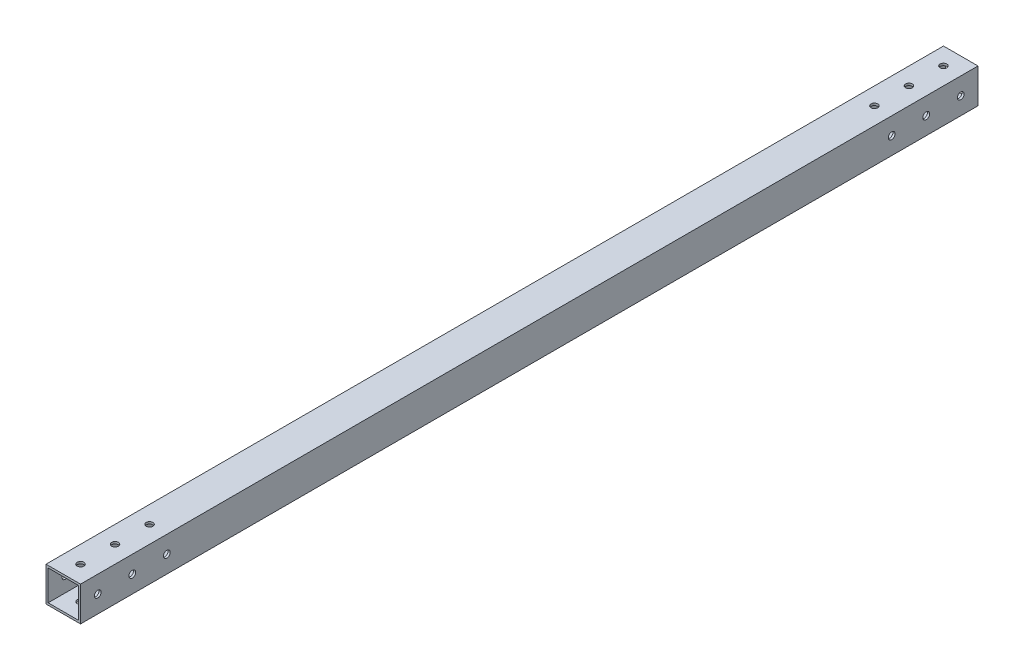
ISO-10303-21;
HEADER;
FILE_DESCRIPTION(('STEP AP214'),'2;1');
FILE_NAME('part.step','',(''),(''),'','','');
FILE_SCHEMA(('AUTOMOTIVE_DESIGN { 1 0 10303 214 1 1 1 1 }'));
ENDSEC;
DATA;
#1=APPLICATION_CONTEXT('core data for automotive mechanical design processes');
#2=APPLICATION_PROTOCOL_DEFINITION('international standard','automotive_design',2000,#1);
#3=PRODUCT_CONTEXT('',#1,'mechanical');
#4=PRODUCT('Part','Part','',(#3));
#5=PRODUCT_RELATED_PRODUCT_CATEGORY('part','',(#4));
#6=PRODUCT_DEFINITION_FORMATION('','',#4);
#7=PRODUCT_DEFINITION_CONTEXT('part definition',#1,'design');
#8=PRODUCT_DEFINITION('design','',#6,#7);
#9=PRODUCT_DEFINITION_SHAPE('','',#8);
#10=(LENGTH_UNIT() NAMED_UNIT(*) SI_UNIT(.MILLI.,.METRE.));
#11=(NAMED_UNIT(*) PLANE_ANGLE_UNIT() SI_UNIT($,.RADIAN.));
#12=(NAMED_UNIT(*) SI_UNIT($,.STERADIAN.) SOLID_ANGLE_UNIT());
#13=UNCERTAINTY_MEASURE_WITH_UNIT(LENGTH_MEASURE(1.E-05),#10,'distance_accuracy_value','');
#14=(GEOMETRIC_REPRESENTATION_CONTEXT(3) GLOBAL_UNCERTAINTY_ASSIGNED_CONTEXT((#13)) GLOBAL_UNIT_ASSIGNED_CONTEXT((#10,
#11,#12)) REPRESENTATION_CONTEXT('',''));
#15=CARTESIAN_POINT('',(0.,0.,0.));
#16=DIRECTION('',(0.,0.,1.));
#17=DIRECTION('',(1.,0.,0.));
#18=AXIS2_PLACEMENT_3D('',#15,#16,#17);
#19=CARTESIAN_POINT('',(0.,0.,330.2));
#20=DIRECTION('',(0.,0.,-1.));
#21=DIRECTION('',(-1.,0.,0.));
#22=AXIS2_PLACEMENT_3D('',#19,#20,#21);
#23=PLANE('',#22);
#24=DIRECTION('',(0.,-1.,0.));
#25=VECTOR('',#24,1.);
#26=CARTESIAN_POINT('',(0.,0.,330.2));
#27=LINE('',#26,#25);
#28=CARTESIAN_POINT('',(0.,25.4,330.2));
#29=VERTEX_POINT('',#28);
#30=CARTESIAN_POINT('',(0.,0.,330.2));
#31=VERTEX_POINT('',#30);
#32=EDGE_CURVE('E135',#29,#31,#27,.T.);
#33=ORIENTED_EDGE('',*,*,#32,.T.);
#34=DIRECTION('',(1.,0.,0.));
#35=VECTOR('',#34,1.);
#36=CARTESIAN_POINT('',(0.,0.,330.2));
#37=LINE('',#36,#35);
#38=CARTESIAN_POINT('',(25.4,0.,330.2));
#39=VERTEX_POINT('',#38);
#40=EDGE_CURVE('E138',#31,#39,#37,.T.);
#41=ORIENTED_EDGE('',*,*,#40,.T.);
#42=DIRECTION('',(0.,1.,0.));
#43=VECTOR('',#42,1.);
#44=CARTESIAN_POINT('',(25.4,0.,330.2));
#45=LINE('',#44,#43);
#46=CARTESIAN_POINT('',(25.4,25.4,330.2));
#47=VERTEX_POINT('',#46);
#48=EDGE_CURVE('E141',#39,#47,#45,.T.);
#49=ORIENTED_EDGE('',*,*,#48,.T.);
#50=DIRECTION('',(-1.,0.,0.));
#51=VECTOR('',#50,1.);
#52=CARTESIAN_POINT('',(0.,25.4,330.2));
#53=LINE('',#52,#51);
#54=EDGE_CURVE('E143',#47,#29,#53,.T.);
#55=ORIENTED_EDGE('',*,*,#54,.T.);
#56=EDGE_LOOP('',(#33,#41,#49,#55));
#57=FACE_BOUND('',#56,.T.);
#58=DIRECTION('',(0.,-1.,0.));
#59=VECTOR('',#58,1.);
#60=CARTESIAN_POINT('',(1.5875,0.,330.2));
#61=LINE('',#60,#59);
#62=CARTESIAN_POINT('',(1.5875,23.8125,330.2));
#63=VERTEX_POINT('',#62);
#64=CARTESIAN_POINT('',(1.5875,1.5875,330.2));
#65=VERTEX_POINT('',#64);
#66=EDGE_CURVE('E123',#63,#65,#61,.T.);
#67=ORIENTED_EDGE('',*,*,#66,.F.);
#68=DIRECTION('',(-1.,0.,0.));
#69=VECTOR('',#68,1.);
#70=CARTESIAN_POINT('',(0.,23.8125,330.2));
#71=LINE('',#70,#69);
#72=CARTESIAN_POINT('',(23.8125,23.8125,330.2));
#73=VERTEX_POINT('',#72);
#74=EDGE_CURVE('E107',#73,#63,#71,.T.);
#75=ORIENTED_EDGE('',*,*,#74,.F.);
#76=DIRECTION('',(0.,1.,0.));
#77=VECTOR('',#76,1.);
#78=CARTESIAN_POINT('',(23.8125,0.,330.2));
#79=LINE('',#78,#77);
#80=CARTESIAN_POINT('',(23.8125,1.5875,330.2));
#81=VERTEX_POINT('',#80);
#82=EDGE_CURVE('E132',#81,#73,#79,.T.);
#83=ORIENTED_EDGE('',*,*,#82,.F.);
#84=DIRECTION('',(1.,0.,0.));
#85=VECTOR('',#84,1.);
#86=CARTESIAN_POINT('',(0.,1.5875,330.2));
#87=LINE('',#86,#85);
#88=EDGE_CURVE('E125',#65,#81,#87,.T.);
#89=ORIENTED_EDGE('',*,*,#88,.F.);
#90=EDGE_LOOP('',(#67,#75,#83,#89));
#91=FACE_BOUND('',#90,.T.);
#92=ADVANCED_FACE('F35',(#57,#91),#23,.F.);
#93=CARTESIAN_POINT('',(0.,0.,-330.2));
#94=DIRECTION('',(0.,0.,-1.));
#95=DIRECTION('',(-1.,0.,0.));
#96=AXIS2_PLACEMENT_3D('',#93,#94,#95);
#97=PLANE('',#96);
#98=DIRECTION('',(0.,-1.,0.));
#99=VECTOR('',#98,1.);
#100=CARTESIAN_POINT('',(0.,0.,-330.2));
#101=LINE('',#100,#99);
#102=CARTESIAN_POINT('',(0.,25.4,-330.2));
#103=VERTEX_POINT('',#102);
#104=CARTESIAN_POINT('',(0.,0.,-330.2));
#105=VERTEX_POINT('',#104);
#106=EDGE_CURVE('E146',#103,#105,#101,.T.);
#107=ORIENTED_EDGE('',*,*,#106,.F.);
#108=DIRECTION('',(-1.,0.,0.));
#109=VECTOR('',#108,1.);
#110=CARTESIAN_POINT('',(0.,25.4,-330.2));
#111=LINE('',#110,#109);
#112=CARTESIAN_POINT('',(25.4,25.4,-330.2));
#113=VERTEX_POINT('',#112);
#114=EDGE_CURVE('E139',#113,#103,#111,.T.);
#115=ORIENTED_EDGE('',*,*,#114,.F.);
#116=DIRECTION('',(0.,1.,0.));
#117=VECTOR('',#116,1.);
#118=CARTESIAN_POINT('',(25.4,0.,-330.2));
#119=LINE('',#118,#117);
#120=CARTESIAN_POINT('',(25.4,0.,-330.2));
#121=VERTEX_POINT('',#120);
#122=EDGE_CURVE('E151',#121,#113,#119,.T.);
#123=ORIENTED_EDGE('',*,*,#122,.F.);
#124=DIRECTION('',(1.,0.,0.));
#125=VECTOR('',#124,1.);
#126=CARTESIAN_POINT('',(0.,0.,-330.2));
#127=LINE('',#126,#125);
#128=EDGE_CURVE('E149',#105,#121,#127,.T.);
#129=ORIENTED_EDGE('',*,*,#128,.F.);
#130=EDGE_LOOP('',(#107,#115,#123,#129));
#131=FACE_BOUND('',#130,.T.);
#132=DIRECTION('',(-1.,0.,0.));
#133=VECTOR('',#132,1.);
#134=CARTESIAN_POINT('',(0.,23.8125,-330.2));
#135=LINE('',#134,#133);
#136=CARTESIAN_POINT('',(23.8125,23.8125,-330.2));
#137=VERTEX_POINT('',#136);
#138=CARTESIAN_POINT('',(1.5875,23.8125,-330.2));
#139=VERTEX_POINT('',#138);
#140=EDGE_CURVE('E105',#137,#139,#135,.T.);
#141=ORIENTED_EDGE('',*,*,#140,.T.);
#142=DIRECTION('',(0.,-1.,0.));
#143=VECTOR('',#142,1.);
#144=CARTESIAN_POINT('',(1.5875,0.,-330.2));
#145=LINE('',#144,#143);
#146=CARTESIAN_POINT('',(1.5875,1.5875,-330.2));
#147=VERTEX_POINT('',#146);
#148=EDGE_CURVE('E113',#139,#147,#145,.T.);
#149=ORIENTED_EDGE('',*,*,#148,.T.);
#150=DIRECTION('',(1.,0.,0.));
#151=VECTOR('',#150,1.);
#152=CARTESIAN_POINT('',(0.,1.5875,-330.2));
#153=LINE('',#152,#151);
#154=CARTESIAN_POINT('',(23.8125,1.5875,-330.2));
#155=VERTEX_POINT('',#154);
#156=EDGE_CURVE('E119',#147,#155,#153,.T.);
#157=ORIENTED_EDGE('',*,*,#156,.T.);
#158=DIRECTION('',(0.,1.,0.));
#159=VECTOR('',#158,1.);
#160=CARTESIAN_POINT('',(23.8125,0.,-330.2));
#161=LINE('',#160,#159);
#162=EDGE_CURVE('E59',#155,#137,#161,.T.);
#163=ORIENTED_EDGE('',*,*,#162,.T.);
#164=EDGE_LOOP('',(#141,#149,#157,#163));
#165=FACE_BOUND('',#164,.T.);
#166=ADVANCED_FACE('F122',(#131,#165),#97,.T.);
#167=CARTESIAN_POINT('',(0.,0.,330.2));
#168=DIRECTION('',(1.,0.,0.));
#169=DIRECTION('',(0.,0.,-1.));
#170=AXIS2_PLACEMENT_3D('',#167,#168,#169);
#171=PLANE('',#170);
#172=CARTESIAN_POINT('',(0.,12.7,266.7));
#173=DIRECTION('',(-1.,0.,0.));
#174=DIRECTION('',(0.,1.,0.));
#175=AXIS2_PLACEMENT_3D('',#172,#173,#174);
#176=CIRCLE('',#175,2.48920000000001);
#177=CARTESIAN_POINT('',(0.,15.1892,266.7));
#178=VERTEX_POINT('',#177);
#179=EDGE_CURVE('E663',#178,#178,#176,.T.);
#180=ORIENTED_EDGE('',*,*,#179,.F.);
#181=EDGE_LOOP('',(#180));
#182=FACE_BOUND('',#181,.T.);
#183=CARTESIAN_POINT('',(0.,12.7,317.5));
#184=DIRECTION('',(-1.,0.,0.));
#185=DIRECTION('',(0.,1.,0.));
#186=AXIS2_PLACEMENT_3D('',#183,#184,#185);
#187=CIRCLE('',#186,2.48920000000001);
#188=CARTESIAN_POINT('',(0.,15.1892,317.5));
#189=VERTEX_POINT('',#188);
#190=EDGE_CURVE('E668',#189,#189,#187,.T.);
#191=ORIENTED_EDGE('',*,*,#190,.F.);
#192=EDGE_LOOP('',(#191));
#193=FACE_BOUND('',#192,.T.);
#194=CARTESIAN_POINT('',(0.,12.7,292.1));
#195=DIRECTION('',(-1.,0.,0.));
#196=DIRECTION('',(0.,1.,0.));
#197=AXIS2_PLACEMENT_3D('',#194,#195,#196);
#198=CIRCLE('',#197,2.48920000000001);
#199=CARTESIAN_POINT('',(0.,15.1892,292.1));
#200=VERTEX_POINT('',#199);
#201=EDGE_CURVE('E202',#200,#200,#198,.T.);
#202=ORIENTED_EDGE('',*,*,#201,.F.);
#203=EDGE_LOOP('',(#202));
#204=FACE_BOUND('',#203,.T.);
#205=CARTESIAN_POINT('',(0.,12.7,-266.7));
#206=DIRECTION('',(1.,0.,0.));
#207=DIRECTION('',(0.,1.,0.));
#208=AXIS2_PLACEMENT_3D('',#205,#206,#207);
#209=CIRCLE('',#208,2.48920000000001);
#210=CARTESIAN_POINT('',(0.,15.1892,-266.7));
#211=VERTEX_POINT('',#210);
#212=EDGE_CURVE('E252',#211,#211,#209,.T.);
#213=ORIENTED_EDGE('',*,*,#212,.T.);
#214=EDGE_LOOP('',(#213));
#215=FACE_BOUND('',#214,.T.);
#216=CARTESIAN_POINT('',(0.,12.7,-317.5));
#217=DIRECTION('',(1.,0.,0.));
#218=DIRECTION('',(0.,1.,0.));
#219=AXIS2_PLACEMENT_3D('',#216,#217,#218);
#220=CIRCLE('',#219,2.48920000000001);
#221=CARTESIAN_POINT('',(0.,15.1892,-317.5));
#222=VERTEX_POINT('',#221);
#223=EDGE_CURVE('E245',#222,#222,#220,.T.);
#224=ORIENTED_EDGE('',*,*,#223,.T.);
#225=EDGE_LOOP('',(#224));
#226=FACE_BOUND('',#225,.T.);
#227=CARTESIAN_POINT('',(0.,12.7,-292.1));
#228=DIRECTION('',(1.,0.,0.));
#229=DIRECTION('',(0.,1.,0.));
#230=AXIS2_PLACEMENT_3D('',#227,#228,#229);
#231=CIRCLE('',#230,2.48920000000001);
#232=CARTESIAN_POINT('',(0.,15.1892,-292.1));
#233=VERTEX_POINT('',#232);
#234=EDGE_CURVE('E177',#233,#233,#231,.T.);
#235=ORIENTED_EDGE('',*,*,#234,.T.);
#236=EDGE_LOOP('',(#235));
#237=FACE_BOUND('',#236,.T.);
#238=ORIENTED_EDGE('',*,*,#106,.T.);
#239=DIRECTION('',(0.,0.,-1.));
#240=VECTOR('',#239,1.);
#241=CARTESIAN_POINT('',(0.,0.,330.2));
#242=LINE('',#241,#240);
#243=EDGE_CURVE('E11',#31,#105,#242,.T.);
#244=ORIENTED_EDGE('',*,*,#243,.F.);
#245=ORIENTED_EDGE('',*,*,#32,.F.);
#246=DIRECTION('',(0.,0.,-1.));
#247=VECTOR('',#246,1.);
#248=CARTESIAN_POINT('',(0.,25.4,330.2));
#249=LINE('',#248,#247);
#250=EDGE_CURVE('E145',#29,#103,#249,.T.);
#251=ORIENTED_EDGE('',*,*,#250,.T.);
#252=EDGE_LOOP('',(#238,#244,#245,#251));
#253=FACE_BOUND('',#252,.T.);
#254=ADVANCED_FACE('F37',(#182,#193,#204,#215,#226,#237,#253),#171,.F.);
#255=CARTESIAN_POINT('',(0.,0.,330.2));
#256=DIRECTION('',(0.,1.,0.));
#257=DIRECTION('',(0.,0.,1.));
#258=AXIS2_PLACEMENT_3D('',#255,#256,#257);
#259=PLANE('',#258);
#260=CARTESIAN_POINT('',(12.7,0.,317.5));
#261=DIRECTION('',(0.,-1.,0.));
#262=DIRECTION('',(0.,0.,-1.));
#263=AXIS2_PLACEMENT_3D('',#260,#261,#262);
#264=CIRCLE('',#263,2.4892);
#265=CARTESIAN_POINT('',(12.7,0.,315.0108));
#266=VERTEX_POINT('',#265);
#267=EDGE_CURVE('E190',#266,#266,#264,.T.);
#268=ORIENTED_EDGE('',*,*,#267,.F.);
#269=EDGE_LOOP('',(#268));
#270=FACE_BOUND('',#269,.T.);
#271=CARTESIAN_POINT('',(12.7,0.,292.1));
#272=DIRECTION('',(0.,-1.,0.));
#273=DIRECTION('',(0.,0.,-1.));
#274=AXIS2_PLACEMENT_3D('',#271,#272,#273);
#275=CIRCLE('',#274,2.4892);
#276=CARTESIAN_POINT('',(12.7,0.,289.6108));
#277=VERTEX_POINT('',#276);
#278=EDGE_CURVE('E227',#277,#277,#275,.T.);
#279=ORIENTED_EDGE('',*,*,#278,.F.);
#280=EDGE_LOOP('',(#279));
#281=FACE_BOUND('',#280,.T.);
#282=CARTESIAN_POINT('',(12.7,0.,266.7));
#283=DIRECTION('',(0.,-1.,0.));
#284=DIRECTION('',(0.,0.,-1.));
#285=AXIS2_PLACEMENT_3D('',#282,#283,#284);
#286=CIRCLE('',#285,2.4892);
#287=CARTESIAN_POINT('',(12.7,0.,264.2108));
#288=VERTEX_POINT('',#287);
#289=EDGE_CURVE('E233',#288,#288,#286,.T.);
#290=ORIENTED_EDGE('',*,*,#289,.F.);
#291=EDGE_LOOP('',(#290));
#292=FACE_BOUND('',#291,.T.);
#293=CARTESIAN_POINT('',(12.7,0.,-317.5));
#294=DIRECTION('',(0.,1.,0.));
#295=DIRECTION('',(0.,0.,1.));
#296=AXIS2_PLACEMENT_3D('',#293,#294,#295);
#297=CIRCLE('',#296,2.4892);
#298=CARTESIAN_POINT('',(12.7,0.,-315.0108));
#299=VERTEX_POINT('',#298);
#300=EDGE_CURVE('E165',#299,#299,#297,.T.);
#301=ORIENTED_EDGE('',*,*,#300,.T.);
#302=EDGE_LOOP('',(#301));
#303=FACE_BOUND('',#302,.T.);
#304=CARTESIAN_POINT('',(12.7,0.,-292.1));
#305=DIRECTION('',(0.,1.,0.));
#306=DIRECTION('',(0.,0.,1.));
#307=AXIS2_PLACEMENT_3D('',#304,#305,#306);
#308=CIRCLE('',#307,2.4892);
#309=CARTESIAN_POINT('',(12.7,0.,-289.6108));
#310=VERTEX_POINT('',#309);
#311=EDGE_CURVE('E273',#310,#310,#308,.T.);
#312=ORIENTED_EDGE('',*,*,#311,.T.);
#313=EDGE_LOOP('',(#312));
#314=FACE_BOUND('',#313,.T.);
#315=CARTESIAN_POINT('',(12.7,0.,-266.7));
#316=DIRECTION('',(0.,1.,0.));
#317=DIRECTION('',(0.,0.,1.));
#318=AXIS2_PLACEMENT_3D('',#315,#316,#317);
#319=CIRCLE('',#318,2.4892);
#320=CARTESIAN_POINT('',(12.7,0.,-264.2108));
#321=VERTEX_POINT('',#320);
#322=EDGE_CURVE('E279',#321,#321,#319,.T.);
#323=ORIENTED_EDGE('',*,*,#322,.T.);
#324=EDGE_LOOP('',(#323));
#325=FACE_BOUND('',#324,.T.);
#326=ORIENTED_EDGE('',*,*,#128,.T.);
#327=DIRECTION('',(0.,0.,-1.));
#328=VECTOR('',#327,1.);
#329=CARTESIAN_POINT('',(25.4,0.,330.2));
#330=LINE('',#329,#328);
#331=EDGE_CURVE('E44',#39,#121,#330,.T.);
#332=ORIENTED_EDGE('',*,*,#331,.F.);
#333=ORIENTED_EDGE('',*,*,#40,.F.);
#334=ORIENTED_EDGE('',*,*,#243,.T.);
#335=EDGE_LOOP('',(#326,#332,#333,#334));
#336=FACE_BOUND('',#335,.T.);
#337=ADVANCED_FACE('F326',(#270,#281,#292,#303,#314,#325,#336),#259,.F.);
#338=CARTESIAN_POINT('',(25.4,0.,330.2));
#339=DIRECTION('',(-1.,0.,0.));
#340=DIRECTION('',(0.,-1.,0.));
#341=AXIS2_PLACEMENT_3D('',#338,#339,#340);
#342=PLANE('',#341);
#343=CARTESIAN_POINT('',(25.4,12.7,266.7));
#344=DIRECTION('',(-1.,0.,0.));
#345=DIRECTION('',(0.,1.,0.));
#346=AXIS2_PLACEMENT_3D('',#343,#344,#345);
#347=CIRCLE('',#346,2.48920000000001);
#348=CARTESIAN_POINT('',(25.4,15.1892,266.7));
#349=VERTEX_POINT('',#348);
#350=EDGE_CURVE('E665',#349,#349,#347,.T.);
#351=ORIENTED_EDGE('',*,*,#350,.T.);
#352=EDGE_LOOP('',(#351));
#353=FACE_BOUND('',#352,.T.);
#354=CARTESIAN_POINT('',(25.4,12.7,317.5));
#355=DIRECTION('',(-1.,0.,0.));
#356=DIRECTION('',(0.,1.,0.));
#357=AXIS2_PLACEMENT_3D('',#354,#355,#356);
#358=CIRCLE('',#357,2.48920000000001);
#359=CARTESIAN_POINT('',(25.4,15.1892,317.5));
#360=VERTEX_POINT('',#359);
#361=EDGE_CURVE('E664',#360,#360,#358,.T.);
#362=ORIENTED_EDGE('',*,*,#361,.T.);
#363=EDGE_LOOP('',(#362));
#364=FACE_BOUND('',#363,.T.);
#365=CARTESIAN_POINT('',(25.4,12.7,292.1));
#366=DIRECTION('',(-1.,0.,0.));
#367=DIRECTION('',(0.,1.,0.));
#368=AXIS2_PLACEMENT_3D('',#365,#366,#367);
#369=CIRCLE('',#368,2.48920000000001);
#370=CARTESIAN_POINT('',(25.4,15.1892,292.1));
#371=VERTEX_POINT('',#370);
#372=EDGE_CURVE('E215',#371,#371,#369,.T.);
#373=ORIENTED_EDGE('',*,*,#372,.T.);
#374=EDGE_LOOP('',(#373));
#375=FACE_BOUND('',#374,.T.);
#376=CARTESIAN_POINT('',(25.4,12.7,-266.7));
#377=DIRECTION('',(1.,0.,0.));
#378=DIRECTION('',(0.,1.,0.));
#379=AXIS2_PLACEMENT_3D('',#376,#377,#378);
#380=CIRCLE('',#379,2.48920000000001);
#381=CARTESIAN_POINT('',(25.4,15.1892,-266.7));
#382=VERTEX_POINT('',#381);
#383=EDGE_CURVE('E244',#382,#382,#380,.T.);
#384=ORIENTED_EDGE('',*,*,#383,.F.);
#385=EDGE_LOOP('',(#384));
#386=FACE_BOUND('',#385,.T.);
#387=CARTESIAN_POINT('',(25.4,12.7,-317.5));
#388=DIRECTION('',(1.,0.,0.));
#389=DIRECTION('',(0.,1.,0.));
#390=AXIS2_PLACEMENT_3D('',#387,#388,#389);
#391=CIRCLE('',#390,2.48920000000001);
#392=CARTESIAN_POINT('',(25.4,15.1892,-317.5));
#393=VERTEX_POINT('',#392);
#394=EDGE_CURVE('E249',#393,#393,#391,.T.);
#395=ORIENTED_EDGE('',*,*,#394,.F.);
#396=EDGE_LOOP('',(#395));
#397=FACE_BOUND('',#396,.T.);
#398=CARTESIAN_POINT('',(25.4,12.7,-292.1));
#399=DIRECTION('',(1.,0.,0.));
#400=DIRECTION('',(0.,1.,0.));
#401=AXIS2_PLACEMENT_3D('',#398,#399,#400);
#402=CIRCLE('',#401,2.48920000000001);
#403=CARTESIAN_POINT('',(25.4,15.1892,-292.1));
#404=VERTEX_POINT('',#403);
#405=EDGE_CURVE('E248',#404,#404,#402,.T.);
#406=ORIENTED_EDGE('',*,*,#405,.F.);
#407=EDGE_LOOP('',(#406));
#408=FACE_BOUND('',#407,.T.);
#409=ORIENTED_EDGE('',*,*,#122,.T.);
#410=DIRECTION('',(0.,0.,-1.));
#411=VECTOR('',#410,1.);
#412=CARTESIAN_POINT('',(25.4,25.4,330.2));
#413=LINE('',#412,#411);
#414=EDGE_CURVE('E156',#47,#113,#413,.T.);
#415=ORIENTED_EDGE('',*,*,#414,.F.);
#416=ORIENTED_EDGE('',*,*,#48,.F.);
#417=ORIENTED_EDGE('',*,*,#331,.T.);
#418=EDGE_LOOP('',(#409,#415,#416,#417));
#419=FACE_BOUND('',#418,.T.);
#420=ADVANCED_FACE('F323',(#353,#364,#375,#386,#397,#408,#419),#342,.F.);
#421=CARTESIAN_POINT('',(0.,25.4,330.2));
#422=DIRECTION('',(0.,-1.,0.));
#423=DIRECTION('',(0.,0.,-1.));
#424=AXIS2_PLACEMENT_3D('',#421,#422,#423);
#425=PLANE('',#424);
#426=CARTESIAN_POINT('',(12.7,25.4,317.5));
#427=DIRECTION('',(0.,-1.,0.));
#428=DIRECTION('',(0.,0.,-1.));
#429=AXIS2_PLACEMENT_3D('',#426,#427,#428);
#430=CIRCLE('',#429,2.4892);
#431=CARTESIAN_POINT('',(12.7,25.4,315.0108));
#432=VERTEX_POINT('',#431);
#433=EDGE_CURVE('E224',#432,#432,#430,.T.);
#434=ORIENTED_EDGE('',*,*,#433,.T.);
#435=EDGE_LOOP('',(#434));
#436=FACE_BOUND('',#435,.T.);
#437=CARTESIAN_POINT('',(12.7,25.4,292.1));
#438=DIRECTION('',(0.,-1.,0.));
#439=DIRECTION('',(0.,0.,-1.));
#440=AXIS2_PLACEMENT_3D('',#437,#438,#439);
#441=CIRCLE('',#440,2.4892);
#442=CARTESIAN_POINT('',(12.7,25.4,289.6108));
#443=VERTEX_POINT('',#442);
#444=EDGE_CURVE('E230',#443,#443,#441,.T.);
#445=ORIENTED_EDGE('',*,*,#444,.T.);
#446=EDGE_LOOP('',(#445));
#447=FACE_BOUND('',#446,.T.);
#448=CARTESIAN_POINT('',(12.7,25.4,266.7));
#449=DIRECTION('',(0.,-1.,0.));
#450=DIRECTION('',(0.,0.,-1.));
#451=AXIS2_PLACEMENT_3D('',#448,#449,#450);
#452=CIRCLE('',#451,2.4892);
#453=CARTESIAN_POINT('',(12.7,25.4,264.2108));
#454=VERTEX_POINT('',#453);
#455=EDGE_CURVE('E221',#454,#454,#452,.T.);
#456=ORIENTED_EDGE('',*,*,#455,.T.);
#457=EDGE_LOOP('',(#456));
#458=FACE_BOUND('',#457,.T.);
#459=CARTESIAN_POINT('',(12.7,25.4,-317.5));
#460=DIRECTION('',(0.,1.,0.));
#461=DIRECTION('',(0.,0.,1.));
#462=AXIS2_PLACEMENT_3D('',#459,#460,#461);
#463=CIRCLE('',#462,2.4892);
#464=CARTESIAN_POINT('',(12.7,25.4,-315.0108));
#465=VERTEX_POINT('',#464);
#466=EDGE_CURVE('E270',#465,#465,#463,.T.);
#467=ORIENTED_EDGE('',*,*,#466,.F.);
#468=EDGE_LOOP('',(#467));
#469=FACE_BOUND('',#468,.T.);
#470=CARTESIAN_POINT('',(12.7,25.4,-292.1));
#471=DIRECTION('',(0.,1.,0.));
#472=DIRECTION('',(0.,0.,1.));
#473=AXIS2_PLACEMENT_3D('',#470,#471,#472);
#474=CIRCLE('',#473,2.4892);
#475=CARTESIAN_POINT('',(12.7,25.4,-289.6108));
#476=VERTEX_POINT('',#475);
#477=EDGE_CURVE('E276',#476,#476,#474,.T.);
#478=ORIENTED_EDGE('',*,*,#477,.F.);
#479=EDGE_LOOP('',(#478));
#480=FACE_BOUND('',#479,.T.);
#481=CARTESIAN_POINT('',(12.7,25.4,-266.7));
#482=DIRECTION('',(0.,1.,0.));
#483=DIRECTION('',(0.,0.,1.));
#484=AXIS2_PLACEMENT_3D('',#481,#482,#483);
#485=CIRCLE('',#484,2.4892);
#486=CARTESIAN_POINT('',(12.7,25.4,-264.2108));
#487=VERTEX_POINT('',#486);
#488=EDGE_CURVE('E267',#487,#487,#485,.T.);
#489=ORIENTED_EDGE('',*,*,#488,.F.);
#490=EDGE_LOOP('',(#489));
#491=FACE_BOUND('',#490,.T.);
#492=ORIENTED_EDGE('',*,*,#114,.T.);
#493=ORIENTED_EDGE('',*,*,#250,.F.);
#494=ORIENTED_EDGE('',*,*,#54,.F.);
#495=ORIENTED_EDGE('',*,*,#414,.T.);
#496=EDGE_LOOP('',(#492,#493,#494,#495));
#497=FACE_BOUND('',#496,.T.);
#498=ADVANCED_FACE('F307',(#436,#447,#458,#469,#480,#491,#497),#425,.F.);
#499=CARTESIAN_POINT('',(1.5875,0.,330.2));
#500=DIRECTION('',(1.,0.,0.));
#501=DIRECTION('',(0.,0.,-1.));
#502=AXIS2_PLACEMENT_3D('',#499,#500,#501);
#503=PLANE('',#502);
#504=CARTESIAN_POINT('',(1.5875,12.7,266.7));
#505=DIRECTION('',(1.,0.,0.));
#506=DIRECTION('',(0.,0.,-1.));
#507=AXIS2_PLACEMENT_3D('',#504,#505,#506);
#508=CIRCLE('',#507,2.48920000000001);
#509=CARTESIAN_POINT('',(1.5875,12.7,264.2108));
#510=VERTEX_POINT('',#509);
#511=EDGE_CURVE('E218',#510,#510,#508,.F.);
#512=ORIENTED_EDGE('',*,*,#511,.T.);
#513=EDGE_LOOP('',(#512));
#514=FACE_BOUND('',#513,.T.);
#515=CARTESIAN_POINT('',(1.5875,12.7,317.5));
#516=DIRECTION('',(1.,0.,0.));
#517=DIRECTION('',(0.,0.,-1.));
#518=AXIS2_PLACEMENT_3D('',#515,#516,#517);
#519=CIRCLE('',#518,2.48920000000001);
#520=CARTESIAN_POINT('',(1.5875,12.7,315.0108));
#521=VERTEX_POINT('',#520);
#522=EDGE_CURVE('E205',#521,#521,#519,.F.);
#523=ORIENTED_EDGE('',*,*,#522,.T.);
#524=EDGE_LOOP('',(#523));
#525=FACE_BOUND('',#524,.T.);
#526=CARTESIAN_POINT('',(1.5875,12.7,292.1));
#527=DIRECTION('',(1.,0.,0.));
#528=DIRECTION('',(0.,0.,-1.));
#529=AXIS2_PLACEMENT_3D('',#526,#527,#528);
#530=CIRCLE('',#529,2.48920000000001);
#531=CARTESIAN_POINT('',(1.5875,12.7,289.6108));
#532=VERTEX_POINT('',#531);
#533=EDGE_CURVE('E201',#532,#532,#530,.F.);
#534=ORIENTED_EDGE('',*,*,#533,.T.);
#535=EDGE_LOOP('',(#534));
#536=FACE_BOUND('',#535,.T.);
#537=CARTESIAN_POINT('',(1.5875,12.7,-266.7));
#538=DIRECTION('',(1.,0.,0.));
#539=DIRECTION('',(0.,0.,-1.));
#540=AXIS2_PLACEMENT_3D('',#537,#538,#539);
#541=CIRCLE('',#540,2.48920000000001);
#542=CARTESIAN_POINT('',(1.5875,12.7,-269.1892));
#543=VERTEX_POINT('',#542);
#544=EDGE_CURVE('E185',#543,#543,#541,.T.);
#545=ORIENTED_EDGE('',*,*,#544,.F.);
#546=EDGE_LOOP('',(#545));
#547=FACE_BOUND('',#546,.T.);
#548=CARTESIAN_POINT('',(1.5875,12.7,-317.5));
#549=DIRECTION('',(1.,0.,0.));
#550=DIRECTION('',(0.,0.,-1.));
#551=AXIS2_PLACEMENT_3D('',#548,#549,#550);
#552=CIRCLE('',#551,2.48920000000001);
#553=CARTESIAN_POINT('',(1.5875,12.7,-319.9892));
#554=VERTEX_POINT('',#553);
#555=EDGE_CURVE('E181',#554,#554,#552,.T.);
#556=ORIENTED_EDGE('',*,*,#555,.F.);
#557=EDGE_LOOP('',(#556));
#558=FACE_BOUND('',#557,.T.);
#559=CARTESIAN_POINT('',(1.5875,12.7,-292.1));
#560=DIRECTION('',(1.,0.,0.));
#561=DIRECTION('',(0.,0.,-1.));
#562=AXIS2_PLACEMENT_3D('',#559,#560,#561);
#563=CIRCLE('',#562,2.48920000000001);
#564=CARTESIAN_POINT('',(1.5875,12.7,-294.5892));
#565=VERTEX_POINT('',#564);
#566=EDGE_CURVE('E176',#565,#565,#563,.T.);
#567=ORIENTED_EDGE('',*,*,#566,.F.);
#568=EDGE_LOOP('',(#567));
#569=FACE_BOUND('',#568,.T.);
#570=ORIENTED_EDGE('',*,*,#148,.F.);
#571=DIRECTION('',(0.,0.,-1.));
#572=VECTOR('',#571,1.);
#573=CARTESIAN_POINT('',(1.5875,23.8125,330.2));
#574=LINE('',#573,#572);
#575=EDGE_CURVE('E101',#63,#139,#574,.T.);
#576=ORIENTED_EDGE('',*,*,#575,.F.);
#577=ORIENTED_EDGE('',*,*,#66,.T.);
#578=DIRECTION('',(0.,0.,-1.));
#579=VECTOR('',#578,1.);
#580=CARTESIAN_POINT('',(1.5875,1.5875,330.2));
#581=LINE('',#580,#579);
#582=EDGE_CURVE('E116',#65,#147,#581,.T.);
#583=ORIENTED_EDGE('',*,*,#582,.T.);
#584=EDGE_LOOP('',(#570,#576,#577,#583));
#585=FACE_BOUND('',#584,.T.);
#586=ADVANCED_FACE('F114',(#514,#525,#536,#547,#558,#569,#585),#503,.T.);
#587=CARTESIAN_POINT('',(0.,1.5875,330.2));
#588=DIRECTION('',(0.,1.,0.));
#589=DIRECTION('',(0.,0.,1.));
#590=AXIS2_PLACEMENT_3D('',#587,#588,#589);
#591=PLANE('',#590);
#592=CARTESIAN_POINT('',(12.7,1.5875,317.5));
#593=DIRECTION('',(0.,1.,0.));
#594=DIRECTION('',(0.,0.,1.));
#595=AXIS2_PLACEMENT_3D('',#592,#593,#594);
#596=CIRCLE('',#595,2.4892);
#597=CARTESIAN_POINT('',(12.7,1.5875,319.9892));
#598=VERTEX_POINT('',#597);
#599=EDGE_CURVE('E198',#598,#598,#596,.F.);
#600=ORIENTED_EDGE('',*,*,#599,.T.);
#601=EDGE_LOOP('',(#600));
#602=FACE_BOUND('',#601,.T.);
#603=CARTESIAN_POINT('',(12.7,1.5875,292.1));
#604=DIRECTION('',(0.,1.,0.));
#605=DIRECTION('',(0.,0.,1.));
#606=AXIS2_PLACEMENT_3D('',#603,#604,#605);
#607=CIRCLE('',#606,2.4892);
#608=CARTESIAN_POINT('',(12.7,1.5875,294.5892));
#609=VERTEX_POINT('',#608);
#610=EDGE_CURVE('E194',#609,#609,#607,.F.);
#611=ORIENTED_EDGE('',*,*,#610,.T.);
#612=EDGE_LOOP('',(#611));
#613=FACE_BOUND('',#612,.T.);
#614=CARTESIAN_POINT('',(12.7,1.5875,266.7));
#615=DIRECTION('',(0.,1.,0.));
#616=DIRECTION('',(0.,0.,1.));
#617=AXIS2_PLACEMENT_3D('',#614,#615,#616);
#618=CIRCLE('',#617,2.4892);
#619=CARTESIAN_POINT('',(12.7,1.5875,269.1892));
#620=VERTEX_POINT('',#619);
#621=EDGE_CURVE('E189',#620,#620,#618,.F.);
#622=ORIENTED_EDGE('',*,*,#621,.T.);
#623=EDGE_LOOP('',(#622));
#624=FACE_BOUND('',#623,.T.);
#625=CARTESIAN_POINT('',(12.7,1.5875,-317.5));
#626=DIRECTION('',(0.,1.,0.));
#627=DIRECTION('',(0.,0.,1.));
#628=AXIS2_PLACEMENT_3D('',#625,#626,#627);
#629=CIRCLE('',#628,2.4892);
#630=CARTESIAN_POINT('',(12.7,1.5875,-315.0108));
#631=VERTEX_POINT('',#630);
#632=EDGE_CURVE('E120',#631,#631,#629,.T.);
#633=ORIENTED_EDGE('',*,*,#632,.F.);
#634=EDGE_LOOP('',(#633));
#635=FACE_BOUND('',#634,.T.);
#636=CARTESIAN_POINT('',(12.7,1.5875,-292.1));
#637=DIRECTION('',(0.,1.,0.));
#638=DIRECTION('',(0.,0.,1.));
#639=AXIS2_PLACEMENT_3D('',#636,#637,#638);
#640=CIRCLE('',#639,2.4892);
#641=CARTESIAN_POINT('',(12.7,1.5875,-289.6108));
#642=VERTEX_POINT('',#641);
#643=EDGE_CURVE('E169',#642,#642,#640,.T.);
#644=ORIENTED_EDGE('',*,*,#643,.F.);
#645=EDGE_LOOP('',(#644));
#646=FACE_BOUND('',#645,.T.);
#647=CARTESIAN_POINT('',(12.7,1.5875,-266.7));
#648=DIRECTION('',(0.,1.,0.));
#649=DIRECTION('',(0.,0.,1.));
#650=AXIS2_PLACEMENT_3D('',#647,#648,#649);
#651=CIRCLE('',#650,2.4892);
#652=CARTESIAN_POINT('',(12.7,1.5875,-264.2108));
#653=VERTEX_POINT('',#652);
#654=EDGE_CURVE('E164',#653,#653,#651,.T.);
#655=ORIENTED_EDGE('',*,*,#654,.F.);
#656=EDGE_LOOP('',(#655));
#657=FACE_BOUND('',#656,.T.);
#658=ORIENTED_EDGE('',*,*,#156,.F.);
#659=ORIENTED_EDGE('',*,*,#582,.F.);
#660=ORIENTED_EDGE('',*,*,#88,.T.);
#661=DIRECTION('',(0.,0.,-1.));
#662=VECTOR('',#661,1.);
#663=CARTESIAN_POINT('',(23.8125,1.5875,330.2));
#664=LINE('',#663,#662);
#665=EDGE_CURVE('E290',#81,#155,#664,.T.);
#666=ORIENTED_EDGE('',*,*,#665,.T.);
#667=EDGE_LOOP('',(#658,#659,#660,#666));
#668=FACE_BOUND('',#667,.T.);
#669=ADVANCED_FACE('F297',(#602,#613,#624,#635,#646,#657,#668),#591,.T.);
#670=CARTESIAN_POINT('',(23.8125,0.,330.2));
#671=DIRECTION('',(-1.,0.,0.));
#672=DIRECTION('',(0.,-1.,0.));
#673=AXIS2_PLACEMENT_3D('',#670,#671,#672);
#674=PLANE('',#673);
#675=CARTESIAN_POINT('',(23.8125,12.7,266.7));
#676=DIRECTION('',(-1.,0.,0.));
#677=DIRECTION('',(0.,-1.,0.));
#678=AXIS2_PLACEMENT_3D('',#675,#676,#677);
#679=CIRCLE('',#678,2.48920000000001);
#680=CARTESIAN_POINT('',(23.8125,10.2108,266.7));
#681=VERTEX_POINT('',#680);
#682=EDGE_CURVE('E39',#681,#681,#679,.F.);
#683=ORIENTED_EDGE('',*,*,#682,.T.);
#684=EDGE_LOOP('',(#683));
#685=FACE_BOUND('',#684,.T.);
#686=CARTESIAN_POINT('',(23.8125,12.7,317.5));
#687=DIRECTION('',(-1.,0.,0.));
#688=DIRECTION('',(0.,-1.,0.));
#689=AXIS2_PLACEMENT_3D('',#686,#687,#688);
#690=CIRCLE('',#689,2.48920000000001);
#691=CARTESIAN_POINT('',(23.8125,10.2108,317.5));
#692=VERTEX_POINT('',#691);
#693=EDGE_CURVE('E203',#692,#692,#690,.F.);
#694=ORIENTED_EDGE('',*,*,#693,.T.);
#695=EDGE_LOOP('',(#694));
#696=FACE_BOUND('',#695,.T.);
#697=CARTESIAN_POINT('',(23.8125,12.7,292.1));
#698=DIRECTION('',(-1.,0.,0.));
#699=DIRECTION('',(0.,-1.,0.));
#700=AXIS2_PLACEMENT_3D('',#697,#698,#699);
#701=CIRCLE('',#700,2.48920000000001);
#702=CARTESIAN_POINT('',(23.8125,10.2108,292.1));
#703=VERTEX_POINT('',#702);
#704=EDGE_CURVE('E199',#703,#703,#701,.F.);
#705=ORIENTED_EDGE('',*,*,#704,.T.);
#706=EDGE_LOOP('',(#705));
#707=FACE_BOUND('',#706,.T.);
#708=CARTESIAN_POINT('',(23.8125,12.7,-266.7));
#709=DIRECTION('',(-1.,0.,0.));
#710=DIRECTION('',(0.,-1.,0.));
#711=AXIS2_PLACEMENT_3D('',#708,#709,#710);
#712=CIRCLE('',#711,2.48920000000001);
#713=CARTESIAN_POINT('',(23.8125,10.2108,-266.7));
#714=VERTEX_POINT('',#713);
#715=EDGE_CURVE('E182',#714,#714,#712,.T.);
#716=ORIENTED_EDGE('',*,*,#715,.F.);
#717=EDGE_LOOP('',(#716));
#718=FACE_BOUND('',#717,.T.);
#719=CARTESIAN_POINT('',(23.8125,12.7,-317.5));
#720=DIRECTION('',(-1.,0.,0.));
#721=DIRECTION('',(0.,-1.,0.));
#722=AXIS2_PLACEMENT_3D('',#719,#720,#721);
#723=CIRCLE('',#722,2.48920000000001);
#724=CARTESIAN_POINT('',(23.8125,10.2108,-317.5));
#725=VERTEX_POINT('',#724);
#726=EDGE_CURVE('E178',#725,#725,#723,.T.);
#727=ORIENTED_EDGE('',*,*,#726,.F.);
#728=EDGE_LOOP('',(#727));
#729=FACE_BOUND('',#728,.T.);
#730=CARTESIAN_POINT('',(23.8125,12.7,-292.1));
#731=DIRECTION('',(-1.,0.,0.));
#732=DIRECTION('',(0.,-1.,0.));
#733=AXIS2_PLACEMENT_3D('',#730,#731,#732);
#734=CIRCLE('',#733,2.48920000000001);
#735=CARTESIAN_POINT('',(23.8125,10.2108,-292.1));
#736=VERTEX_POINT('',#735);
#737=EDGE_CURVE('E173',#736,#736,#734,.T.);
#738=ORIENTED_EDGE('',*,*,#737,.F.);
#739=EDGE_LOOP('',(#738));
#740=FACE_BOUND('',#739,.T.);
#741=ORIENTED_EDGE('',*,*,#162,.F.);
#742=ORIENTED_EDGE('',*,*,#665,.F.);
#743=ORIENTED_EDGE('',*,*,#82,.T.);
#744=DIRECTION('',(0.,0.,-1.));
#745=VECTOR('',#744,1.);
#746=CARTESIAN_POINT('',(23.8125,23.8125,330.2));
#747=LINE('',#746,#745);
#748=EDGE_CURVE('E52',#73,#137,#747,.T.);
#749=ORIENTED_EDGE('',*,*,#748,.T.);
#750=EDGE_LOOP('',(#741,#742,#743,#749));
#751=FACE_BOUND('',#750,.T.);
#752=ADVANCED_FACE('F292',(#685,#696,#707,#718,#729,#740,#751),#674,.T.);
#753=CARTESIAN_POINT('',(0.,23.8125,330.2));
#754=DIRECTION('',(0.,-1.,0.));
#755=DIRECTION('',(0.,0.,-1.));
#756=AXIS2_PLACEMENT_3D('',#753,#754,#755);
#757=PLANE('',#756);
#758=CARTESIAN_POINT('',(12.7,23.8125,317.5));
#759=DIRECTION('',(0.,-1.,0.));
#760=DIRECTION('',(0.,0.,-1.));
#761=AXIS2_PLACEMENT_3D('',#758,#759,#760);
#762=CIRCLE('',#761,2.4892);
#763=CARTESIAN_POINT('',(12.7,23.8125,315.0108));
#764=VERTEX_POINT('',#763);
#765=EDGE_CURVE('E195',#764,#764,#762,.F.);
#766=ORIENTED_EDGE('',*,*,#765,.T.);
#767=EDGE_LOOP('',(#766));
#768=FACE_BOUND('',#767,.T.);
#769=CARTESIAN_POINT('',(12.7,23.8125,292.1));
#770=DIRECTION('',(0.,-1.,0.));
#771=DIRECTION('',(0.,0.,-1.));
#772=AXIS2_PLACEMENT_3D('',#769,#770,#771);
#773=CIRCLE('',#772,2.4892);
#774=CARTESIAN_POINT('',(12.7,23.8125,289.6108));
#775=VERTEX_POINT('',#774);
#776=EDGE_CURVE('E191',#775,#775,#773,.F.);
#777=ORIENTED_EDGE('',*,*,#776,.T.);
#778=EDGE_LOOP('',(#777));
#779=FACE_BOUND('',#778,.T.);
#780=CARTESIAN_POINT('',(12.7,23.8125,266.7));
#781=DIRECTION('',(0.,-1.,0.));
#782=DIRECTION('',(0.,0.,-1.));
#783=AXIS2_PLACEMENT_3D('',#780,#781,#782);
#784=CIRCLE('',#783,2.4892);
#785=CARTESIAN_POINT('',(12.7,23.8125,264.2108));
#786=VERTEX_POINT('',#785);
#787=EDGE_CURVE('E186',#786,#786,#784,.F.);
#788=ORIENTED_EDGE('',*,*,#787,.T.);
#789=EDGE_LOOP('',(#788));
#790=FACE_BOUND('',#789,.T.);
#791=CARTESIAN_POINT('',(12.7,23.8125,-317.5));
#792=DIRECTION('',(0.,-1.,0.));
#793=DIRECTION('',(0.,0.,-1.));
#794=AXIS2_PLACEMENT_3D('',#791,#792,#793);
#795=CIRCLE('',#794,2.4892);
#796=CARTESIAN_POINT('',(12.7,23.8125,-319.9892));
#797=VERTEX_POINT('',#796);
#798=EDGE_CURVE('E170',#797,#797,#795,.T.);
#799=ORIENTED_EDGE('',*,*,#798,.F.);
#800=EDGE_LOOP('',(#799));
#801=FACE_BOUND('',#800,.T.);
#802=CARTESIAN_POINT('',(12.7,23.8125,-292.1));
#803=DIRECTION('',(0.,-1.,0.));
#804=DIRECTION('',(0.,0.,-1.));
#805=AXIS2_PLACEMENT_3D('',#802,#803,#804);
#806=CIRCLE('',#805,2.4892);
#807=CARTESIAN_POINT('',(12.7,23.8125,-294.5892));
#808=VERTEX_POINT('',#807);
#809=EDGE_CURVE('E166',#808,#808,#806,.T.);
#810=ORIENTED_EDGE('',*,*,#809,.F.);
#811=EDGE_LOOP('',(#810));
#812=FACE_BOUND('',#811,.T.);
#813=CARTESIAN_POINT('',(12.7,23.8125,-266.7));
#814=DIRECTION('',(0.,-1.,0.));
#815=DIRECTION('',(0.,0.,-1.));
#816=AXIS2_PLACEMENT_3D('',#813,#814,#815);
#817=CIRCLE('',#816,2.4892);
#818=CARTESIAN_POINT('',(12.7,23.8125,-269.1892));
#819=VERTEX_POINT('',#818);
#820=EDGE_CURVE('E161',#819,#819,#817,.T.);
#821=ORIENTED_EDGE('',*,*,#820,.F.);
#822=EDGE_LOOP('',(#821));
#823=FACE_BOUND('',#822,.T.);
#824=ORIENTED_EDGE('',*,*,#140,.F.);
#825=ORIENTED_EDGE('',*,*,#748,.F.);
#826=ORIENTED_EDGE('',*,*,#74,.T.);
#827=ORIENTED_EDGE('',*,*,#575,.T.);
#828=EDGE_LOOP('',(#824,#825,#826,#827));
#829=FACE_BOUND('',#828,.T.);
#830=ADVANCED_FACE('F103',(#768,#779,#790,#801,#812,#823,#829),#757,.T.);
#831=CARTESIAN_POINT('',(12.7,0.,-266.7));
#832=DIRECTION('',(0.,1.,0.));
#833=DIRECTION('',(0.,0.,1.));
#834=AXIS2_PLACEMENT_3D('',#831,#832,#833);
#835=CYLINDRICAL_SURFACE('',#834,2.4892);
#836=ORIENTED_EDGE('',*,*,#820,.T.);
#837=EDGE_LOOP('',(#836));
#838=FACE_BOUND('',#837,.T.);
#839=ORIENTED_EDGE('',*,*,#488,.T.);
#840=EDGE_LOOP('',(#839));
#841=FACE_BOUND('',#840,.T.);
#842=ADVANCED_FACE('F366',(#838,#841),#835,.F.);
#843=CARTESIAN_POINT('',(12.7,0.,-292.1));
#844=DIRECTION('',(0.,1.,0.));
#845=DIRECTION('',(0.,0.,1.));
#846=AXIS2_PLACEMENT_3D('',#843,#844,#845);
#847=CYLINDRICAL_SURFACE('',#846,2.4892);
#848=ORIENTED_EDGE('',*,*,#809,.T.);
#849=EDGE_LOOP('',(#848));
#850=FACE_BOUND('',#849,.T.);
#851=ORIENTED_EDGE('',*,*,#477,.T.);
#852=EDGE_LOOP('',(#851));
#853=FACE_BOUND('',#852,.T.);
#854=ADVANCED_FACE('F374',(#850,#853),#847,.F.);
#855=CARTESIAN_POINT('',(12.7,0.,-317.5));
#856=DIRECTION('',(0.,1.,0.));
#857=DIRECTION('',(0.,0.,1.));
#858=AXIS2_PLACEMENT_3D('',#855,#856,#857);
#859=CYLINDRICAL_SURFACE('',#858,2.4892);
#860=ORIENTED_EDGE('',*,*,#798,.T.);
#861=EDGE_LOOP('',(#860));
#862=FACE_BOUND('',#861,.T.);
#863=ORIENTED_EDGE('',*,*,#466,.T.);
#864=EDGE_LOOP('',(#863));
#865=FACE_BOUND('',#864,.T.);
#866=ADVANCED_FACE('F363',(#862,#865),#859,.F.);
#867=ORIENTED_EDGE('',*,*,#654,.T.);
#868=EDGE_LOOP('',(#867));
#869=FACE_BOUND('',#868,.T.);
#870=ORIENTED_EDGE('',*,*,#322,.F.);
#871=EDGE_LOOP('',(#870));
#872=FACE_BOUND('',#871,.T.);
#873=ADVANCED_FACE('F360',(#869,#872),#835,.F.);
#874=ORIENTED_EDGE('',*,*,#643,.T.);
#875=EDGE_LOOP('',(#874));
#876=FACE_BOUND('',#875,.T.);
#877=ORIENTED_EDGE('',*,*,#311,.F.);
#878=EDGE_LOOP('',(#877));
#879=FACE_BOUND('',#878,.T.);
#880=ADVANCED_FACE('F362',(#876,#879),#847,.F.);
#881=ORIENTED_EDGE('',*,*,#632,.T.);
#882=EDGE_LOOP('',(#881));
#883=FACE_BOUND('',#882,.T.);
#884=ORIENTED_EDGE('',*,*,#300,.F.);
#885=EDGE_LOOP('',(#884));
#886=FACE_BOUND('',#885,.T.);
#887=ADVANCED_FACE('F371',(#883,#886),#859,.F.);
#888=CARTESIAN_POINT('',(0.,12.7,-292.1));
#889=DIRECTION('',(1.,0.,0.));
#890=DIRECTION('',(0.,1.,0.));
#891=AXIS2_PLACEMENT_3D('',#888,#889,#890);
#892=CYLINDRICAL_SURFACE('',#891,2.48920000000001);
#893=ORIENTED_EDGE('',*,*,#737,.T.);
#894=EDGE_LOOP('',(#893));
#895=FACE_BOUND('',#894,.T.);
#896=ORIENTED_EDGE('',*,*,#405,.T.);
#897=EDGE_LOOP('',(#896));
#898=FACE_BOUND('',#897,.T.);
#899=ADVANCED_FACE('F453',(#895,#898),#892,.F.);
#900=CARTESIAN_POINT('',(0.,12.7,-317.5));
#901=DIRECTION('',(1.,0.,0.));
#902=DIRECTION('',(0.,1.,0.));
#903=AXIS2_PLACEMENT_3D('',#900,#901,#902);
#904=CYLINDRICAL_SURFACE('',#903,2.48920000000001);
#905=ORIENTED_EDGE('',*,*,#726,.T.);
#906=EDGE_LOOP('',(#905));
#907=FACE_BOUND('',#906,.T.);
#908=ORIENTED_EDGE('',*,*,#394,.T.);
#909=EDGE_LOOP('',(#908));
#910=FACE_BOUND('',#909,.T.);
#911=ADVANCED_FACE('F457',(#907,#910),#904,.F.);
#912=CARTESIAN_POINT('',(0.,12.7,-266.7));
#913=DIRECTION('',(1.,0.,0.));
#914=DIRECTION('',(0.,1.,0.));
#915=AXIS2_PLACEMENT_3D('',#912,#913,#914);
#916=CYLINDRICAL_SURFACE('',#915,2.48920000000001);
#917=ORIENTED_EDGE('',*,*,#715,.T.);
#918=EDGE_LOOP('',(#917));
#919=FACE_BOUND('',#918,.T.);
#920=ORIENTED_EDGE('',*,*,#383,.T.);
#921=EDGE_LOOP('',(#920));
#922=FACE_BOUND('',#921,.T.);
#923=ADVANCED_FACE('F428',(#919,#922),#916,.F.);
#924=ORIENTED_EDGE('',*,*,#566,.T.);
#925=EDGE_LOOP('',(#924));
#926=FACE_BOUND('',#925,.T.);
#927=ORIENTED_EDGE('',*,*,#234,.F.);
#928=EDGE_LOOP('',(#927));
#929=FACE_BOUND('',#928,.T.);
#930=ADVANCED_FACE('F460',(#926,#929),#892,.F.);
#931=ORIENTED_EDGE('',*,*,#555,.T.);
#932=EDGE_LOOP('',(#931));
#933=FACE_BOUND('',#932,.T.);
#934=ORIENTED_EDGE('',*,*,#223,.F.);
#935=EDGE_LOOP('',(#934));
#936=FACE_BOUND('',#935,.T.);
#937=ADVANCED_FACE('F425',(#933,#936),#904,.F.);
#938=ORIENTED_EDGE('',*,*,#544,.T.);
#939=EDGE_LOOP('',(#938));
#940=FACE_BOUND('',#939,.T.);
#941=ORIENTED_EDGE('',*,*,#212,.F.);
#942=EDGE_LOOP('',(#941));
#943=FACE_BOUND('',#942,.T.);
#944=ADVANCED_FACE('F412',(#940,#943),#916,.F.);
#945=CARTESIAN_POINT('',(12.7,0.,266.7));
#946=DIRECTION('',(0.,1.,0.));
#947=DIRECTION('',(0.,0.,1.));
#948=AXIS2_PLACEMENT_3D('',#945,#946,#947);
#949=CYLINDRICAL_SURFACE('',#948,2.4892);
#950=ORIENTED_EDGE('',*,*,#787,.F.);
#951=EDGE_LOOP('',(#950));
#952=FACE_BOUND('',#951,.T.);
#953=ORIENTED_EDGE('',*,*,#455,.F.);
#954=EDGE_LOOP('',(#953));
#955=FACE_BOUND('',#954,.T.);
#956=ADVANCED_FACE('F408',(#952,#955),#949,.F.);
#957=CARTESIAN_POINT('',(12.7,0.,292.1));
#958=DIRECTION('',(0.,1.,0.));
#959=DIRECTION('',(0.,0.,1.));
#960=AXIS2_PLACEMENT_3D('',#957,#958,#959);
#961=CYLINDRICAL_SURFACE('',#960,2.4892);
#962=ORIENTED_EDGE('',*,*,#776,.F.);
#963=EDGE_LOOP('',(#962));
#964=FACE_BOUND('',#963,.T.);
#965=ORIENTED_EDGE('',*,*,#444,.F.);
#966=EDGE_LOOP('',(#965));
#967=FACE_BOUND('',#966,.T.);
#968=ADVANCED_FACE('F411',(#964,#967),#961,.F.);
#969=CARTESIAN_POINT('',(12.7,0.,317.5));
#970=DIRECTION('',(0.,1.,0.));
#971=DIRECTION('',(0.,0.,1.));
#972=AXIS2_PLACEMENT_3D('',#969,#970,#971);
#973=CYLINDRICAL_SURFACE('',#972,2.4892);
#974=ORIENTED_EDGE('',*,*,#765,.F.);
#975=EDGE_LOOP('',(#974));
#976=FACE_BOUND('',#975,.T.);
#977=ORIENTED_EDGE('',*,*,#433,.F.);
#978=EDGE_LOOP('',(#977));
#979=FACE_BOUND('',#978,.T.);
#980=ADVANCED_FACE('F421',(#976,#979),#973,.F.);
#981=ORIENTED_EDGE('',*,*,#621,.F.);
#982=EDGE_LOOP('',(#981));
#983=FACE_BOUND('',#982,.T.);
#984=ORIENTED_EDGE('',*,*,#289,.T.);
#985=EDGE_LOOP('',(#984));
#986=FACE_BOUND('',#985,.T.);
#987=ADVANCED_FACE('F414',(#983,#986),#949,.F.);
#988=ORIENTED_EDGE('',*,*,#610,.F.);
#989=EDGE_LOOP('',(#988));
#990=FACE_BOUND('',#989,.T.);
#991=ORIENTED_EDGE('',*,*,#278,.T.);
#992=EDGE_LOOP('',(#991));
#993=FACE_BOUND('',#992,.T.);
#994=ADVANCED_FACE('F424',(#990,#993),#961,.F.);
#995=ORIENTED_EDGE('',*,*,#599,.F.);
#996=EDGE_LOOP('',(#995));
#997=FACE_BOUND('',#996,.T.);
#998=ORIENTED_EDGE('',*,*,#267,.T.);
#999=EDGE_LOOP('',(#998));
#1000=FACE_BOUND('',#999,.T.);
#1001=ADVANCED_FACE('F436',(#997,#1000),#973,.F.);
#1002=CARTESIAN_POINT('',(0.,12.7,292.1));
#1003=DIRECTION('',(1.,0.,0.));
#1004=DIRECTION('',(0.,1.,0.));
#1005=AXIS2_PLACEMENT_3D('',#1002,#1003,#1004);
#1006=CYLINDRICAL_SURFACE('',#1005,2.48920000000001);
#1007=ORIENTED_EDGE('',*,*,#704,.F.);
#1008=EDGE_LOOP('',(#1007));
#1009=FACE_BOUND('',#1008,.T.);
#1010=ORIENTED_EDGE('',*,*,#372,.F.);
#1011=EDGE_LOOP('',(#1010));
#1012=FACE_BOUND('',#1011,.T.);
#1013=ADVANCED_FACE('F599',(#1009,#1012),#1006,.F.);
#1014=CARTESIAN_POINT('',(0.,12.7,317.5));
#1015=DIRECTION('',(1.,0.,0.));
#1016=DIRECTION('',(0.,1.,0.));
#1017=AXIS2_PLACEMENT_3D('',#1014,#1015,#1016);
#1018=CYLINDRICAL_SURFACE('',#1017,2.48920000000001);
#1019=ORIENTED_EDGE('',*,*,#693,.F.);
#1020=EDGE_LOOP('',(#1019));
#1021=FACE_BOUND('',#1020,.T.);
#1022=ORIENTED_EDGE('',*,*,#361,.F.);
#1023=EDGE_LOOP('',(#1022));
#1024=FACE_BOUND('',#1023,.T.);
#1025=ADVANCED_FACE('F608',(#1021,#1024),#1018,.F.);
#1026=CARTESIAN_POINT('',(0.,12.7,266.7));
#1027=DIRECTION('',(1.,0.,0.));
#1028=DIRECTION('',(0.,1.,0.));
#1029=AXIS2_PLACEMENT_3D('',#1026,#1027,#1028);
#1030=CYLINDRICAL_SURFACE('',#1029,2.48920000000001);
#1031=ORIENTED_EDGE('',*,*,#682,.F.);
#1032=EDGE_LOOP('',(#1031));
#1033=FACE_BOUND('',#1032,.T.);
#1034=ORIENTED_EDGE('',*,*,#350,.F.);
#1035=EDGE_LOOP('',(#1034));
#1036=FACE_BOUND('',#1035,.T.);
#1037=ADVANCED_FACE('F619',(#1033,#1036),#1030,.F.);
#1038=ORIENTED_EDGE('',*,*,#533,.F.);
#1039=EDGE_LOOP('',(#1038));
#1040=FACE_BOUND('',#1039,.T.);
#1041=ORIENTED_EDGE('',*,*,#201,.T.);
#1042=EDGE_LOOP('',(#1041));
#1043=FACE_BOUND('',#1042,.T.);
#1044=ADVANCED_FACE('F611',(#1040,#1043),#1006,.F.);
#1045=ORIENTED_EDGE('',*,*,#522,.F.);
#1046=EDGE_LOOP('',(#1045));
#1047=FACE_BOUND('',#1046,.T.);
#1048=ORIENTED_EDGE('',*,*,#190,.T.);
#1049=EDGE_LOOP('',(#1048));
#1050=FACE_BOUND('',#1049,.T.);
#1051=ADVANCED_FACE('F622',(#1047,#1050),#1018,.F.);
#1052=ORIENTED_EDGE('',*,*,#511,.F.);
#1053=EDGE_LOOP('',(#1052));
#1054=FACE_BOUND('',#1053,.T.);
#1055=ORIENTED_EDGE('',*,*,#179,.T.);
#1056=EDGE_LOOP('',(#1055));
#1057=FACE_BOUND('',#1056,.T.);
#1058=ADVANCED_FACE('F632',(#1054,#1057),#1030,.F.);
#1059=CLOSED_SHELL('',(#92,#166,#254,#337,#420,#498,#586,#669,#752,#830,#842,#854,#866,#873,
#880,#887,#899,#911,#923,#930,#937,#944,#956,#968,#980,#987,#994,#1001,#1013,#1025,#1037,#1044,
#1051,#1058));
#1060=MANIFOLD_SOLID_BREP('B2',#1059);
#1061=ADVANCED_BREP_SHAPE_REPRESENTATION('',(#18,#1060),#14);
#1062=SHAPE_DEFINITION_REPRESENTATION(#9,#1061);
ENDSEC;
END-ISO-10303-21;
